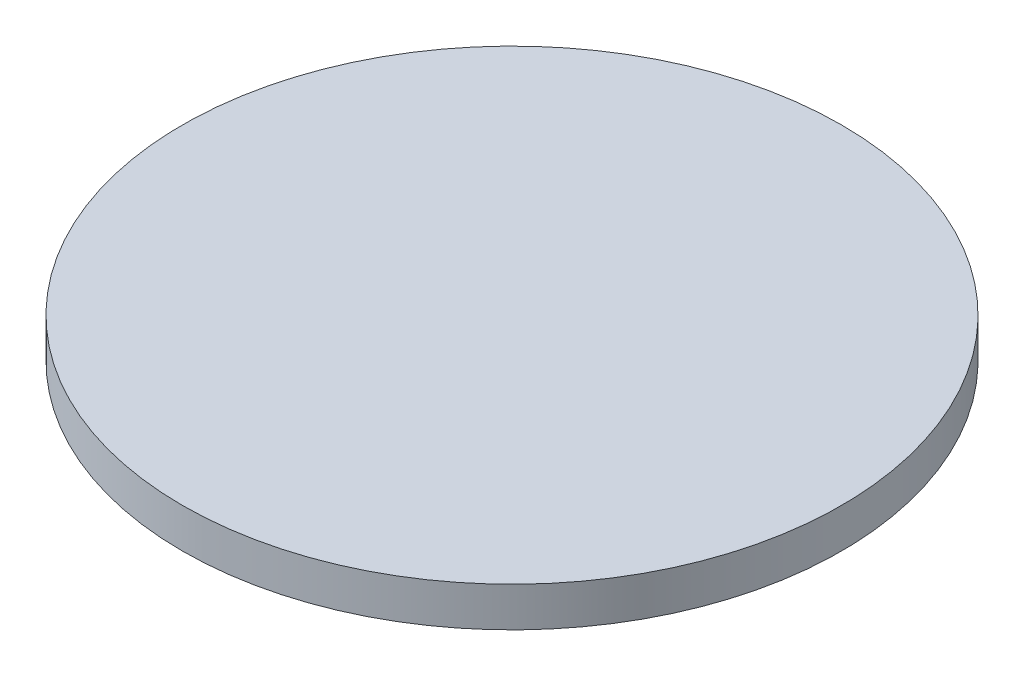
ISO-10303-21;
HEADER;
FILE_DESCRIPTION(('STEP AP214'),'2;1');
FILE_NAME('part.step','',(''),(''),'','','');
FILE_SCHEMA(('AUTOMOTIVE_DESIGN { 1 0 10303 214 1 1 1 1 }'));
ENDSEC;
DATA;
#1=APPLICATION_CONTEXT('core data for automotive mechanical design processes');
#2=APPLICATION_PROTOCOL_DEFINITION('international standard','automotive_design',2000,#1);
#3=PRODUCT_CONTEXT('',#1,'mechanical');
#4=PRODUCT('Part','Part','',(#3));
#5=PRODUCT_RELATED_PRODUCT_CATEGORY('part','',(#4));
#6=PRODUCT_DEFINITION_FORMATION('','',#4);
#7=PRODUCT_DEFINITION_CONTEXT('part definition',#1,'design');
#8=PRODUCT_DEFINITION('design','',#6,#7);
#9=PRODUCT_DEFINITION_SHAPE('','',#8);
#10=(LENGTH_UNIT() NAMED_UNIT(*) SI_UNIT(.MILLI.,.METRE.));
#11=(NAMED_UNIT(*) PLANE_ANGLE_UNIT() SI_UNIT($,.RADIAN.));
#12=(NAMED_UNIT(*) SI_UNIT($,.STERADIAN.) SOLID_ANGLE_UNIT());
#13=UNCERTAINTY_MEASURE_WITH_UNIT(LENGTH_MEASURE(1.E-05),#10,'distance_accuracy_value','');
#14=(GEOMETRIC_REPRESENTATION_CONTEXT(3) GLOBAL_UNCERTAINTY_ASSIGNED_CONTEXT((#13)) GLOBAL_UNIT_ASSIGNED_CONTEXT((#10,
#11,#12)) REPRESENTATION_CONTEXT('',''));
#15=CARTESIAN_POINT('',(0.,0.,0.));
#16=DIRECTION('',(0.,0.,1.));
#17=DIRECTION('',(1.,0.,0.));
#18=AXIS2_PLACEMENT_3D('',#15,#16,#17);
#19=CARTESIAN_POINT('',(0.,0.3,-0.257247877713765));
#20=DIRECTION('',(0.,-1.,0.));
#21=DIRECTION('',(0.,0.,-1.));
#22=AXIS2_PLACEMENT_3D('',#19,#20,#21);
#23=CYLINDRICAL_SURFACE('',#22,2.5);
#24=CARTESIAN_POINT('',(0.,0.3,-0.257247877713765));
#25=DIRECTION('',(0.,1.,0.));
#26=DIRECTION('',(0.,0.,1.));
#27=AXIS2_PLACEMENT_3D('',#24,#25,#26);
#28=CIRCLE('',#27,2.5);
#29=CARTESIAN_POINT('',(0.,0.3,2.24275212228624));
#30=VERTEX_POINT('',#29);
#31=EDGE_CURVE('E10',#30,#30,#28,.T.);
#32=ORIENTED_EDGE('',*,*,#31,.F.);
#33=EDGE_LOOP('',(#32));
#34=FACE_BOUND('',#33,.T.);
#35=CARTESIAN_POINT('',(0.,0.,-0.257247877713765));
#36=DIRECTION('',(0.,1.,0.));
#37=DIRECTION('',(0.,0.,1.));
#38=AXIS2_PLACEMENT_3D('',#35,#36,#37);
#39=CIRCLE('',#38,2.5);
#40=CARTESIAN_POINT('',(0.,0.,2.24275212228624));
#41=VERTEX_POINT('',#40);
#42=EDGE_CURVE('E46',#41,#41,#39,.T.);
#43=ORIENTED_EDGE('',*,*,#42,.T.);
#44=EDGE_LOOP('',(#43));
#45=FACE_BOUND('',#44,.T.);
#46=ADVANCED_FACE('F43',(#34,#45),#23,.T.);
#47=CARTESIAN_POINT('',(0.,0.3,-0.257247877713765));
#48=DIRECTION('',(0.,1.,0.));
#49=DIRECTION('',(0.,0.,1.));
#50=AXIS2_PLACEMENT_3D('',#47,#48,#49);
#51=PLANE('',#50);
#52=ORIENTED_EDGE('',*,*,#31,.T.);
#53=EDGE_LOOP('',(#52));
#54=FACE_BOUND('',#53,.T.);
#55=ADVANCED_FACE('F60',(#54),#51,.T.);
#56=CARTESIAN_POINT('',(0.,0.,-0.257247877713765));
#57=DIRECTION('',(0.,1.,0.));
#58=DIRECTION('',(0.,0.,1.));
#59=AXIS2_PLACEMENT_3D('',#56,#57,#58);
#60=PLANE('',#59);
#61=ORIENTED_EDGE('',*,*,#42,.F.);
#62=EDGE_LOOP('',(#61));
#63=FACE_BOUND('',#62,.T.);
#64=ADVANCED_FACE('F58',(#63),#60,.F.);
#65=CLOSED_SHELL('',(#46,#55,#64));
#66=MANIFOLD_SOLID_BREP('B2',#65);
#67=ADVANCED_BREP_SHAPE_REPRESENTATION('',(#18,#66),#14);
#68=SHAPE_DEFINITION_REPRESENTATION(#9,#67);
ENDSEC;
END-ISO-10303-21;
